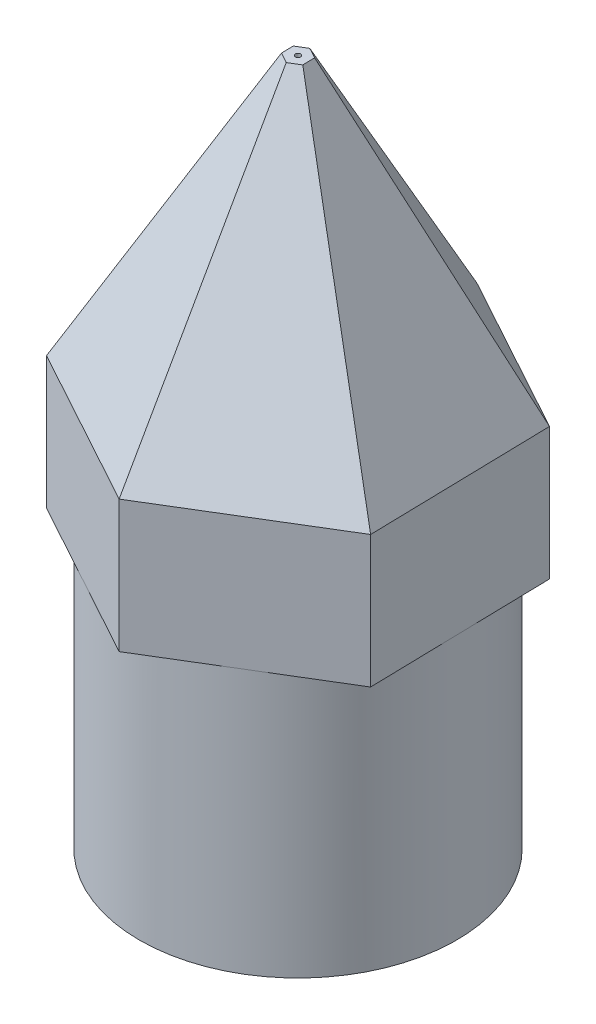
ISO-10303-21;
HEADER;
FILE_DESCRIPTION(('STEP AP214'),'2;1');
FILE_NAME('part.step','',(''),(''),'','','');
FILE_SCHEMA(('AUTOMOTIVE_DESIGN { 1 0 10303 214 1 1 1 1 }'));
ENDSEC;
DATA;
#1=APPLICATION_CONTEXT('core data for automotive mechanical design processes');
#2=APPLICATION_PROTOCOL_DEFINITION('international standard','automotive_design',2000,#1);
#3=PRODUCT_CONTEXT('',#1,'mechanical');
#4=PRODUCT('Part','Part','',(#3));
#5=PRODUCT_RELATED_PRODUCT_CATEGORY('part','',(#4));
#6=PRODUCT_DEFINITION_FORMATION('','',#4);
#7=PRODUCT_DEFINITION_CONTEXT('part definition',#1,'design');
#8=PRODUCT_DEFINITION('design','',#6,#7);
#9=PRODUCT_DEFINITION_SHAPE('','',#8);
#10=(LENGTH_UNIT() NAMED_UNIT(*) SI_UNIT(.MILLI.,.METRE.));
#11=(NAMED_UNIT(*) PLANE_ANGLE_UNIT() SI_UNIT($,.RADIAN.));
#12=(NAMED_UNIT(*) SI_UNIT($,.STERADIAN.) SOLID_ANGLE_UNIT());
#13=UNCERTAINTY_MEASURE_WITH_UNIT(LENGTH_MEASURE(1.E-05),#10,'distance_accuracy_value','');
#14=(GEOMETRIC_REPRESENTATION_CONTEXT(3) GLOBAL_UNCERTAINTY_ASSIGNED_CONTEXT((#13)) GLOBAL_UNIT_ASSIGNED_CONTEXT((#10,
#11,#12)) REPRESENTATION_CONTEXT('',''));
#15=CARTESIAN_POINT('',(0.,0.,0.));
#16=DIRECTION('',(0.,0.,1.));
#17=DIRECTION('',(1.,0.,0.));
#18=AXIS2_PLACEMENT_3D('',#15,#16,#17);
#19=CARTESIAN_POINT('',(0.,0.,0.));
#20=DIRECTION('',(0.,1.,0.));
#21=DIRECTION('',(0.,0.,1.));
#22=AXIS2_PLACEMENT_3D('',#19,#20,#21);
#23=CYLINDRICAL_SURFACE('',#22,0.05);
#24=CARTESIAN_POINT('',(0.,13.,0.));
#25=DIRECTION('',(0.,1.,0.));
#26=DIRECTION('',(0.,0.,1.));
#27=AXIS2_PLACEMENT_3D('',#24,#25,#26);
#28=CIRCLE('',#27,0.05);
#29=CARTESIAN_POINT('',(0.,13.,0.05));
#30=VERTEX_POINT('',#29);
#31=EDGE_CURVE('E297',#30,#30,#28,.T.);
#32=ORIENTED_EDGE('',*,*,#31,.T.);
#33=EDGE_LOOP('',(#32));
#34=FACE_BOUND('',#33,.T.);
#35=CARTESIAN_POINT('',(0.,7.5,0.));
#36=DIRECTION('',(0.,-1.,0.));
#37=DIRECTION('',(0.,0.,-1.));
#38=AXIS2_PLACEMENT_3D('',#35,#36,#37);
#39=CIRCLE('',#38,0.05);
#40=CARTESIAN_POINT('',(0.,7.5,-0.05));
#41=VERTEX_POINT('',#40);
#42=EDGE_CURVE('E43',#41,#41,#39,.F.);
#43=ORIENTED_EDGE('',*,*,#42,.F.);
#44=EDGE_LOOP('',(#43));
#45=FACE_BOUND('',#44,.T.);
#46=ADVANCED_FACE('F39',(#34,#45),#23,.F.);
#47=CARTESIAN_POINT('',(0.,5.,0.));
#48=DIRECTION('',(0.,-1.,0.));
#49=DIRECTION('',(0.,0.,-1.));
#50=AXIS2_PLACEMENT_3D('',#47,#48,#49);
#51=CYLINDRICAL_SURFACE('',#50,3.);
#52=CARTESIAN_POINT('',(0.,5.,0.));
#53=DIRECTION('',(0.,1.,0.));
#54=DIRECTION('',(0.,0.,1.));
#55=AXIS2_PLACEMENT_3D('',#52,#53,#54);
#56=CIRCLE('',#55,3.);
#57=CARTESIAN_POINT('',(1.55829101424744,5.,2.56353839739445));
#58=VERTEX_POINT('',#57);
#59=CARTESIAN_POINT('',(2.99923488284416,5.,-0.0677504061300782));
#60=VERTEX_POINT('',#59);
#61=EDGE_CURVE('E11',#58,#60,#56,.T.);
#62=ORIENTED_EDGE('',*,*,#61,.F.);
#63=CARTESIAN_POINT('',(-1.44094386859672,5.,2.63128880352452));
#64=VERTEX_POINT('',#63);
#65=EDGE_CURVE('E51',#64,#58,#56,.T.);
#66=ORIENTED_EDGE('',*,*,#65,.F.);
#67=CARTESIAN_POINT('',(-2.99923488284416,5.,0.0677504061300774));
#68=VERTEX_POINT('',#67);
#69=EDGE_CURVE('E61',#68,#64,#56,.T.);
#70=ORIENTED_EDGE('',*,*,#69,.F.);
#71=CARTESIAN_POINT('',(-1.55829101424744,5.,-2.56353839739445));
#72=VERTEX_POINT('',#71);
#73=EDGE_CURVE('E231',#72,#68,#56,.T.);
#74=ORIENTED_EDGE('',*,*,#73,.F.);
#75=CARTESIAN_POINT('',(1.44094386859672,5.,-2.63128880352453));
#76=VERTEX_POINT('',#75);
#77=EDGE_CURVE('E236',#76,#72,#56,.T.);
#78=ORIENTED_EDGE('',*,*,#77,.F.);
#79=EDGE_CURVE('E49',#60,#76,#56,.T.);
#80=ORIENTED_EDGE('',*,*,#79,.F.);
#81=EDGE_LOOP('',(#62,#66,#70,#74,#78,#80));
#82=FACE_BOUND('',#81,.T.);
#83=CARTESIAN_POINT('',(0.,0.,0.));
#84=DIRECTION('',(0.,1.,0.));
#85=DIRECTION('',(0.,0.,1.));
#86=AXIS2_PLACEMENT_3D('',#83,#84,#85);
#87=CIRCLE('',#86,3.);
#88=CARTESIAN_POINT('',(0.,0.,3.));
#89=VERTEX_POINT('',#88);
#90=EDGE_CURVE('E222',#89,#89,#87,.T.);
#91=ORIENTED_EDGE('',*,*,#90,.T.);
#92=EDGE_LOOP('',(#91));
#93=FACE_BOUND('',#92,.T.);
#94=ADVANCED_FACE('F41',(#82,#93),#51,.T.);
#95=CARTESIAN_POINT('',(0.,0.,0.));
#96=DIRECTION('',(0.,1.,0.));
#97=DIRECTION('',(0.,0.,1.));
#98=AXIS2_PLACEMENT_3D('',#95,#96,#97);
#99=PLANE('',#98);
#100=CARTESIAN_POINT('',(-0.05,0.,0.));
#101=DIRECTION('',(0.,-1.,0.));
#102=DIRECTION('',(0.,0.,-1.));
#103=AXIS2_PLACEMENT_3D('',#100,#101,#102);
#104=CIRCLE('',#103,2.12749457724864);
#105=CARTESIAN_POINT('',(-0.05,0.,-2.12749457724864));
#106=VERTEX_POINT('',#105);
#107=EDGE_CURVE('E307',#106,#106,#104,.T.);
#108=ORIENTED_EDGE('',*,*,#107,.F.);
#109=EDGE_LOOP('',(#108));
#110=FACE_BOUND('',#109,.T.);
#111=ORIENTED_EDGE('',*,*,#90,.F.);
#112=EDGE_LOOP('',(#111));
#113=FACE_BOUND('',#112,.T.);
#114=ADVANCED_FACE('F353',(#110,#113),#99,.F.);
#115=CARTESIAN_POINT('',(0.,5.,0.));
#116=DIRECTION('',(0.,1.,0.));
#117=DIRECTION('',(0.,0.,1.));
#118=AXIS2_PLACEMENT_3D('',#115,#116,#117);
#119=PLANE('',#118);
#120=DIRECTION('',(0.854512799131482,0.,-0.51943033808248));
#121=VECTOR('',#120,1.);
#122=CARTESIAN_POINT('',(0.0782314304338125,5.,3.46321813394598));
#123=LINE('',#122,#121);
#124=CARTESIAN_POINT('',(3.03835059806106,5.,1.66385866084291));
#125=VERTEX_POINT('',#124);
#126=EDGE_CURVE('E167',#58,#125,#123,.T.);
#127=ORIENTED_EDGE('',*,*,#126,.F.);
#128=ORIENTED_EDGE('',*,*,#61,.T.);
#129=DIRECTION('',(-0.0225834687100261,0.,-0.999744960948053));
#130=VECTOR('',#129,1.);
#131=CARTESIAN_POINT('',(3.03835059806106,5.,1.66385866084291));
#132=LINE('',#131,#130);
#133=EDGE_CURVE('E186',#125,#60,#132,.T.);
#134=ORIENTED_EDGE('',*,*,#133,.F.);
#135=EDGE_LOOP('',(#127,#128,#134));
#136=FACE_BOUND('',#135,.T.);
#137=ADVANCED_FACE('F481',(#136),#119,.F.);
#138=CARTESIAN_POINT('',(2.96011916762725,5.,-1.79935947310307));
#139=VERTEX_POINT('',#138);
#140=EDGE_CURVE('E185',#60,#139,#132,.T.);
#141=ORIENTED_EDGE('',*,*,#140,.F.);
#142=ORIENTED_EDGE('',*,*,#79,.T.);
#143=DIRECTION('',(-0.877096267841508,0.,-0.480314622865573));
#144=VECTOR('',#143,1.);
#145=CARTESIAN_POINT('',(2.96011916762725,5.,-1.79935947310307));
#146=LINE('',#145,#144);
#147=EDGE_CURVE('E191',#139,#76,#146,.T.);
#148=ORIENTED_EDGE('',*,*,#147,.F.);
#149=EDGE_LOOP('',(#141,#142,#148));
#150=FACE_BOUND('',#149,.T.);
#151=ADVANCED_FACE('F250',(#150),#119,.F.);
#152=CARTESIAN_POINT('',(-0.0782314304338134,5.,-3.46321813394598));
#153=VERTEX_POINT('',#152);
#154=EDGE_CURVE('E190',#76,#153,#146,.T.);
#155=ORIENTED_EDGE('',*,*,#154,.F.);
#156=ORIENTED_EDGE('',*,*,#77,.T.);
#157=DIRECTION('',(-0.854512799131482,0.,0.51943033808248));
#158=VECTOR('',#157,1.);
#159=CARTESIAN_POINT('',(-0.0782314304338134,5.,-3.46321813394598));
#160=LINE('',#159,#158);
#161=EDGE_CURVE('E196',#153,#72,#160,.T.);
#162=ORIENTED_EDGE('',*,*,#161,.F.);
#163=EDGE_LOOP('',(#155,#156,#162));
#164=FACE_BOUND('',#163,.T.);
#165=ADVANCED_FACE('F251',(#164),#119,.F.);
#166=CARTESIAN_POINT('',(-3.03835059806107,5.,-1.66385866084291));
#167=VERTEX_POINT('',#166);
#168=EDGE_CURVE('E195',#72,#167,#160,.T.);
#169=ORIENTED_EDGE('',*,*,#168,.F.);
#170=ORIENTED_EDGE('',*,*,#73,.T.);
#171=DIRECTION('',(0.0225834687100258,0.,0.999744960948053));
#172=VECTOR('',#171,1.);
#173=CARTESIAN_POINT('',(-3.03835059806107,5.,-1.66385866084291));
#174=LINE('',#173,#172);
#175=EDGE_CURVE('E201',#167,#68,#174,.T.);
#176=ORIENTED_EDGE('',*,*,#175,.F.);
#177=EDGE_LOOP('',(#169,#170,#176));
#178=FACE_BOUND('',#177,.T.);
#179=ADVANCED_FACE('F488',(#178),#119,.F.);
#180=CARTESIAN_POINT('',(-2.96011916762725,5.,1.79935947310307));
#181=VERTEX_POINT('',#180);
#182=EDGE_CURVE('E200',#68,#181,#174,.T.);
#183=ORIENTED_EDGE('',*,*,#182,.F.);
#184=ORIENTED_EDGE('',*,*,#69,.T.);
#185=DIRECTION('',(0.877096267841508,0.,0.480314622865573));
#186=VECTOR('',#185,1.);
#187=CARTESIAN_POINT('',(-2.96011916762725,5.,1.79935947310307));
#188=LINE('',#187,#186);
#189=EDGE_CURVE('E144',#181,#64,#188,.T.);
#190=ORIENTED_EDGE('',*,*,#189,.F.);
#191=EDGE_LOOP('',(#183,#184,#190));
#192=FACE_BOUND('',#191,.T.);
#193=ADVANCED_FACE('F479',(#192),#119,.F.);
#194=CARTESIAN_POINT('',(0.0782314304338125,5.,3.46321813394598));
#195=VERTEX_POINT('',#194);
#196=EDGE_CURVE('E155',#64,#195,#188,.T.);
#197=ORIENTED_EDGE('',*,*,#196,.F.);
#198=ORIENTED_EDGE('',*,*,#65,.T.);
#199=EDGE_CURVE('E182',#195,#58,#123,.T.);
#200=ORIENTED_EDGE('',*,*,#199,.F.);
#201=EDGE_LOOP('',(#197,#198,#200));
#202=FACE_BOUND('',#201,.T.);
#203=ADVANCED_FACE('F471',(#202),#119,.F.);
#204=CARTESIAN_POINT('',(0.0782314304338125,7.5,3.46321813394598));
#205=DIRECTION('',(-0.51943033808248,0.,-0.854512799131482));
#206=DIRECTION('',(-0.854512799131482,0.,0.51943033808248));
#207=AXIS2_PLACEMENT_3D('',#204,#205,#206);
#208=PLANE('',#207);
#209=ORIENTED_EDGE('',*,*,#199,.T.);
#210=ORIENTED_EDGE('',*,*,#126,.T.);
#211=DIRECTION('',(0.,-1.,0.));
#212=VECTOR('',#211,1.);
#213=CARTESIAN_POINT('',(3.03835059806106,7.5,1.66385866084291));
#214=LINE('',#213,#212);
#215=CARTESIAN_POINT('',(3.03835059806106,7.5,1.66385866084291));
#216=VERTEX_POINT('',#215);
#217=EDGE_CURVE('E137',#216,#125,#214,.T.);
#218=ORIENTED_EDGE('',*,*,#217,.F.);
#219=DIRECTION('',(0.854512799131482,0.,-0.51943033808248));
#220=VECTOR('',#219,1.);
#221=CARTESIAN_POINT('',(0.0782314304338125,7.5,3.46321813394598));
#222=LINE('',#221,#220);
#223=CARTESIAN_POINT('',(0.0782314304338125,7.5,3.46321813394598));
#224=VERTEX_POINT('',#223);
#225=EDGE_CURVE('E130',#224,#216,#222,.T.);
#226=ORIENTED_EDGE('',*,*,#225,.F.);
#227=DIRECTION('',(0.,-1.,0.));
#228=VECTOR('',#227,1.);
#229=CARTESIAN_POINT('',(0.0782314304338125,7.5,3.46321813394598));
#230=LINE('',#229,#228);
#231=EDGE_CURVE('E134',#224,#195,#230,.T.);
#232=ORIENTED_EDGE('',*,*,#231,.T.);
#233=EDGE_LOOP('',(#209,#210,#218,#226,#232));
#234=FACE_BOUND('',#233,.T.);
#235=ADVANCED_FACE('F133',(#234),#208,.F.);
#236=CARTESIAN_POINT('',(3.03835059806106,7.5,1.66385866084291));
#237=DIRECTION('',(-0.999744960948053,0.,0.0225834687100261));
#238=DIRECTION('',(0.0225834687100261,0.,0.999744960948053));
#239=AXIS2_PLACEMENT_3D('',#236,#237,#238);
#240=PLANE('',#239);
#241=ORIENTED_EDGE('',*,*,#133,.T.);
#242=ORIENTED_EDGE('',*,*,#140,.T.);
#243=DIRECTION('',(0.,-1.,0.));
#244=VECTOR('',#243,1.);
#245=CARTESIAN_POINT('',(2.96011916762725,7.5,-1.79935947310307));
#246=LINE('',#245,#244);
#247=CARTESIAN_POINT('',(2.96011916762725,7.5,-1.79935947310307));
#248=VERTEX_POINT('',#247);
#249=EDGE_CURVE('E217',#248,#139,#246,.T.);
#250=ORIENTED_EDGE('',*,*,#249,.F.);
#251=DIRECTION('',(-0.0225834687100261,0.,-0.999744960948053));
#252=VECTOR('',#251,1.);
#253=CARTESIAN_POINT('',(3.03835059806106,7.5,1.66385866084291));
#254=LINE('',#253,#252);
#255=EDGE_CURVE('E143',#216,#248,#254,.T.);
#256=ORIENTED_EDGE('',*,*,#255,.F.);
#257=ORIENTED_EDGE('',*,*,#217,.T.);
#258=EDGE_LOOP('',(#241,#242,#250,#256,#257));
#259=FACE_BOUND('',#258,.T.);
#260=ADVANCED_FACE('F260',(#259),#240,.F.);
#261=CARTESIAN_POINT('',(2.96011916762725,7.5,-1.79935947310307));
#262=DIRECTION('',(-0.480314622865573,0.,0.877096267841508));
#263=DIRECTION('',(0.877096267841508,0.,0.480314622865573));
#264=AXIS2_PLACEMENT_3D('',#261,#262,#263);
#265=PLANE('',#264);
#266=ORIENTED_EDGE('',*,*,#147,.T.);
#267=ORIENTED_EDGE('',*,*,#154,.T.);
#268=DIRECTION('',(0.,-1.,0.));
#269=VECTOR('',#268,1.);
#270=CARTESIAN_POINT('',(-0.0782314304338134,7.5,-3.46321813394598));
#271=LINE('',#270,#269);
#272=CARTESIAN_POINT('',(-0.0782314304338134,7.5,-3.46321813394598));
#273=VERTEX_POINT('',#272);
#274=EDGE_CURVE('E213',#273,#153,#271,.T.);
#275=ORIENTED_EDGE('',*,*,#274,.F.);
#276=DIRECTION('',(-0.877096267841508,0.,-0.480314622865573));
#277=VECTOR('',#276,1.);
#278=CARTESIAN_POINT('',(2.96011916762725,7.5,-1.79935947310307));
#279=LINE('',#278,#277);
#280=EDGE_CURVE('E257',#248,#273,#279,.T.);
#281=ORIENTED_EDGE('',*,*,#280,.F.);
#282=ORIENTED_EDGE('',*,*,#249,.T.);
#283=EDGE_LOOP('',(#266,#267,#275,#281,#282));
#284=FACE_BOUND('',#283,.T.);
#285=ADVANCED_FACE('F254',(#284),#265,.F.);
#286=CARTESIAN_POINT('',(-0.0782314304338134,7.5,-3.46321813394598));
#287=DIRECTION('',(0.51943033808248,0.,0.854512799131482));
#288=DIRECTION('',(0.854512799131482,0.,-0.51943033808248));
#289=AXIS2_PLACEMENT_3D('',#286,#287,#288);
#290=PLANE('',#289);
#291=ORIENTED_EDGE('',*,*,#161,.T.);
#292=ORIENTED_EDGE('',*,*,#168,.T.);
#293=DIRECTION('',(0.,-1.,0.));
#294=VECTOR('',#293,1.);
#295=CARTESIAN_POINT('',(-3.03835059806107,7.5,-1.66385866084291));
#296=LINE('',#295,#294);
#297=CARTESIAN_POINT('',(-3.03835059806107,7.5,-1.66385866084291));
#298=VERTEX_POINT('',#297);
#299=EDGE_CURVE('E209',#298,#167,#296,.T.);
#300=ORIENTED_EDGE('',*,*,#299,.F.);
#301=DIRECTION('',(-0.854512799131482,0.,0.51943033808248));
#302=VECTOR('',#301,1.);
#303=CARTESIAN_POINT('',(-0.0782314304338134,7.5,-3.46321813394598));
#304=LINE('',#303,#302);
#305=EDGE_CURVE('E178',#273,#298,#304,.T.);
#306=ORIENTED_EDGE('',*,*,#305,.F.);
#307=ORIENTED_EDGE('',*,*,#274,.T.);
#308=EDGE_LOOP('',(#291,#292,#300,#306,#307));
#309=FACE_BOUND('',#308,.T.);
#310=ADVANCED_FACE('F441',(#309),#290,.F.);
#311=CARTESIAN_POINT('',(-3.03835059806107,7.5,-1.66385866084291));
#312=DIRECTION('',(0.999744960948053,0.,-0.0225834687100258));
#313=DIRECTION('',(-0.0225834687100258,0.,-0.999744960948053));
#314=AXIS2_PLACEMENT_3D('',#311,#312,#313);
#315=PLANE('',#314);
#316=ORIENTED_EDGE('',*,*,#175,.T.);
#317=ORIENTED_EDGE('',*,*,#182,.T.);
#318=DIRECTION('',(0.,-1.,0.));
#319=VECTOR('',#318,1.);
#320=CARTESIAN_POINT('',(-2.96011916762725,7.5,1.79935947310307));
#321=LINE('',#320,#319);
#322=CARTESIAN_POINT('',(-2.96011916762725,7.5,1.79935947310307));
#323=VERTEX_POINT('',#322);
#324=EDGE_CURVE('E157',#323,#181,#321,.T.);
#325=ORIENTED_EDGE('',*,*,#324,.F.);
#326=DIRECTION('',(0.0225834687100258,0.,0.999744960948053));
#327=VECTOR('',#326,1.);
#328=CARTESIAN_POINT('',(-3.03835059806107,7.5,-1.66385866084291));
#329=LINE('',#328,#327);
#330=EDGE_CURVE('E175',#298,#323,#329,.T.);
#331=ORIENTED_EDGE('',*,*,#330,.F.);
#332=ORIENTED_EDGE('',*,*,#299,.T.);
#333=EDGE_LOOP('',(#316,#317,#325,#331,#332));
#334=FACE_BOUND('',#333,.T.);
#335=ADVANCED_FACE('F433',(#334),#315,.F.);
#336=CARTESIAN_POINT('',(-2.96011916762725,7.5,1.79935947310307));
#337=DIRECTION('',(0.480314622865573,0.,-0.877096267841508));
#338=DIRECTION('',(-0.877096267841508,0.,-0.480314622865573));
#339=AXIS2_PLACEMENT_3D('',#336,#337,#338);
#340=PLANE('',#339);
#341=ORIENTED_EDGE('',*,*,#189,.T.);
#342=ORIENTED_EDGE('',*,*,#196,.T.);
#343=ORIENTED_EDGE('',*,*,#231,.F.);
#344=DIRECTION('',(0.877096267841508,0.,0.480314622865573));
#345=VECTOR('',#344,1.);
#346=CARTESIAN_POINT('',(-2.96011916762725,7.5,1.79935947310307));
#347=LINE('',#346,#345);
#348=EDGE_CURVE('E152',#323,#224,#347,.T.);
#349=ORIENTED_EDGE('',*,*,#348,.F.);
#350=ORIENTED_EDGE('',*,*,#324,.T.);
#351=EDGE_LOOP('',(#341,#342,#343,#349,#350));
#352=FACE_BOUND('',#351,.T.);
#353=ADVANCED_FACE('F149',(#352),#340,.F.);
#354=CARTESIAN_POINT('',(-2.96011916762725,7.5,1.79935947310307));
#355=DIRECTION('',(-0.427963462636301,0.453990499739548,0.781498496988051));
#356=DIRECTION('',(0.,-0.864684581342474,0.502315214570084));
#357=AXIS2_PLACEMENT_3D('',#354,#355,#356);
#358=PLANE('',#357);
#359=ORIENTED_EDGE('',*,*,#348,.T.);
#360=DIRECTION('',(0.011451921892067,-0.861891266296484,0.506963804000661));
#361=VECTOR('',#360,1.);
#362=CARTESIAN_POINT('',(0.0782314304338128,7.5,3.46321813394598));
#363=LINE('',#362,#361);
#364=CARTESIAN_POINT('',(0.00515310504711373,13.,0.228122210553155));
#365=VERTEX_POINT('',#364);
#366=EDGE_CURVE('E160',#365,#224,#363,.T.);
#367=ORIENTED_EDGE('',*,*,#366,.F.);
#368=DIRECTION('',(-0.877096267841508,0.,-0.480314622865573));
#369=VECTOR('',#368,1.);
#370=CARTESIAN_POINT('',(-1.61409028499844,13.,-0.658606312567004));
#371=LINE('',#370,#369);
#372=CARTESIAN_POINT('',(-0.194983076982938,13.,0.11852382515575));
#373=VERTEX_POINT('',#372);
#374=EDGE_CURVE('E294',#373,#365,#371,.F.);
#375=ORIENTED_EDGE('',*,*,#374,.F.);
#376=DIRECTION('',(-0.433317572117734,-0.861891266296484,0.263399557281016));
#377=VECTOR('',#376,1.);
#378=CARTESIAN_POINT('',(-2.96011916762725,7.5,1.79935947310307));
#379=LINE('',#378,#377);
#380=EDGE_CURVE('E173',#373,#323,#379,.T.);
#381=ORIENTED_EDGE('',*,*,#380,.T.);
#382=EDGE_LOOP('',(#359,#367,#375,#381));
#383=FACE_BOUND('',#382,.T.);
#384=ADVANCED_FACE('F171',(#383),#358,.T.);
#385=CARTESIAN_POINT('',(0.0782314304338125,7.5,3.46321813394598));
#386=DIRECTION('',(0.462815820092859,0.453990499739548,0.761376479028614));
#387=DIRECTION('',(0.854512799131482,0.,-0.51943033808248));
#388=AXIS2_PLACEMENT_3D('',#385,#386,#387);
#389=PLANE('',#388);
#390=ORIENTED_EDGE('',*,*,#225,.T.);
#391=DIRECTION('',(0.444769494009801,-0.861891266296484,0.243564246719645));
#392=VECTOR('',#391,1.);
#393=CARTESIAN_POINT('',(3.03835059806106,7.5,1.66385866084291));
#394=LINE('',#393,#392);
#395=CARTESIAN_POINT('',(0.200136182030052,13.,0.109598385397406));
#396=VERTEX_POINT('',#395);
#397=EDGE_CURVE('E168',#396,#216,#394,.T.);
#398=ORIENTED_EDGE('',*,*,#397,.F.);
#399=DIRECTION('',(-0.854512799131482,0.,0.51943033808248));
#400=VECTOR('',#399,1.);
#401=CARTESIAN_POINT('',(-1.37741494027504,13.,1.06854003452682));
#402=LINE('',#401,#400);
#403=EDGE_CURVE('E162',#365,#396,#402,.F.);
#404=ORIENTED_EDGE('',*,*,#403,.F.);
#405=ORIENTED_EDGE('',*,*,#366,.T.);
#406=EDGE_LOOP('',(#390,#398,#404,#405));
#407=FACE_BOUND('',#406,.T.);
#408=ADVANCED_FACE('F161',(#407),#389,.T.);
#409=CARTESIAN_POINT('',(3.03835059806106,7.5,1.66385866084291));
#410=DIRECTION('',(0.890779282729159,0.453990499739548,-0.0201220179594371));
#411=DIRECTION('',(-0.454082437038674,0.890959673819763,0.));
#412=AXIS2_PLACEMENT_3D('',#409,#410,#411);
#413=PLANE('',#412);
#414=ORIENTED_EDGE('',*,*,#255,.T.);
#415=DIRECTION('',(0.433317572117734,-0.861891266296484,-0.263399557281016));
#416=VECTOR('',#415,1.);
#417=CARTESIAN_POINT('',(2.96011916762725,7.5,-1.79935947310307));
#418=LINE('',#417,#416);
#419=CARTESIAN_POINT('',(0.194983076982937,13.,-0.11852382515575));
#420=VERTEX_POINT('',#419);
#421=EDGE_CURVE('E266',#420,#248,#418,.T.);
#422=ORIENTED_EDGE('',*,*,#421,.F.);
#423=DIRECTION('',(0.0225834687100261,0.,0.999744960948053));
#424=VECTOR('',#423,1.);
#425=CARTESIAN_POINT('',(0.236675344723401,13.,1.72714634709382));
#426=LINE('',#425,#424);
#427=EDGE_CURVE('E289',#396,#420,#426,.F.);
#428=ORIENTED_EDGE('',*,*,#427,.F.);
#429=ORIENTED_EDGE('',*,*,#397,.T.);
#430=EDGE_LOOP('',(#414,#422,#428,#429));
#431=FACE_BOUND('',#430,.T.);
#432=ADVANCED_FACE('F338',(#431),#413,.T.);
#433=CARTESIAN_POINT('',(2.96011916762725,7.5,-1.79935947310307));
#434=DIRECTION('',(0.427963462636301,0.453990499739548,-0.781498496988051));
#435=DIRECTION('',(0.,0.864684581342474,0.502315214570084));
#436=AXIS2_PLACEMENT_3D('',#433,#434,#435);
#437=PLANE('',#436);
#438=ORIENTED_EDGE('',*,*,#280,.T.);
#439=DIRECTION('',(-0.011451921892067,-0.861891266296484,-0.506963804000661));
#440=VECTOR('',#439,1.);
#441=CARTESIAN_POINT('',(-0.0782314304338134,7.5,-3.46321813394598));
#442=LINE('',#441,#440);
#443=CARTESIAN_POINT('',(-0.00515310504711403,13.,-0.228122210553156));
#444=VERTEX_POINT('',#443);
#445=EDGE_CURVE('E270',#444,#273,#442,.T.);
#446=ORIENTED_EDGE('',*,*,#445,.F.);
#447=DIRECTION('',(0.877096267841508,0.,0.480314622865573));
#448=VECTOR('',#447,1.);
#449=CARTESIAN_POINT('',(1.61409028499844,13.,0.658606312567003));
#450=LINE('',#449,#448);
#451=EDGE_CURVE('E286',#420,#444,#450,.F.);
#452=ORIENTED_EDGE('',*,*,#451,.F.);
#453=ORIENTED_EDGE('',*,*,#421,.T.);
#454=EDGE_LOOP('',(#438,#446,#452,#453));
#455=FACE_BOUND('',#454,.T.);
#456=ADVANCED_FACE('F336',(#455),#437,.T.);
#457=CARTESIAN_POINT('',(-0.0782314304338134,7.5,-3.46321813394598));
#458=DIRECTION('',(-0.462815820092859,0.453990499739548,-0.761376479028614));
#459=DIRECTION('',(-0.854512799131482,0.,0.51943033808248));
#460=AXIS2_PLACEMENT_3D('',#457,#458,#459);
#461=PLANE('',#460);
#462=ORIENTED_EDGE('',*,*,#305,.T.);
#463=DIRECTION('',(-0.444769494009801,-0.861891266296484,-0.243564246719646));
#464=VECTOR('',#463,1.);
#465=CARTESIAN_POINT('',(-3.03835059806107,7.5,-1.66385866084291));
#466=LINE('',#465,#464);
#467=CARTESIAN_POINT('',(-0.200136182030053,13.,-0.109598385397407));
#468=VERTEX_POINT('',#467);
#469=EDGE_CURVE('E274',#468,#298,#466,.T.);
#470=ORIENTED_EDGE('',*,*,#469,.F.);
#471=DIRECTION('',(0.854512799131482,0.,-0.51943033808248));
#472=VECTOR('',#471,1.);
#473=CARTESIAN_POINT('',(1.37741494027504,13.,-1.06854003452682));
#474=LINE('',#473,#472);
#475=EDGE_CURVE('E283',#444,#468,#474,.F.);
#476=ORIENTED_EDGE('',*,*,#475,.F.);
#477=ORIENTED_EDGE('',*,*,#445,.T.);
#478=EDGE_LOOP('',(#462,#470,#476,#477));
#479=FACE_BOUND('',#478,.T.);
#480=ADVANCED_FACE('F322',(#479),#461,.T.);
#481=CARTESIAN_POINT('',(-3.03835059806107,7.5,-1.66385866084291));
#482=DIRECTION('',(-0.89077928272916,0.453990499739548,0.0201220179594369));
#483=DIRECTION('',(-0.454082437038674,-0.890959673819763,0.));
#484=AXIS2_PLACEMENT_3D('',#481,#482,#483);
#485=PLANE('',#484);
#486=ORIENTED_EDGE('',*,*,#330,.T.);
#487=ORIENTED_EDGE('',*,*,#380,.F.);
#488=DIRECTION('',(-0.0225834687100258,0.,-0.999744960948053));
#489=VECTOR('',#488,1.);
#490=CARTESIAN_POINT('',(-0.236675344723402,13.,-1.72714634709382));
#491=LINE('',#490,#489);
#492=EDGE_CURVE('E280',#468,#373,#491,.F.);
#493=ORIENTED_EDGE('',*,*,#492,.F.);
#494=ORIENTED_EDGE('',*,*,#469,.T.);
#495=EDGE_LOOP('',(#486,#487,#493,#494));
#496=FACE_BOUND('',#495,.T.);
#497=ADVANCED_FACE('F328',(#496),#485,.T.);
#498=CARTESIAN_POINT('',(0.,13.,0.));
#499=DIRECTION('',(0.,1.,0.));
#500=DIRECTION('',(0.,0.,1.));
#501=AXIS2_PLACEMENT_3D('',#498,#499,#500);
#502=PLANE('',#501);
#503=ORIENTED_EDGE('',*,*,#31,.F.);
#504=EDGE_LOOP('',(#503));
#505=FACE_BOUND('',#504,.T.);
#506=ORIENTED_EDGE('',*,*,#374,.T.);
#507=ORIENTED_EDGE('',*,*,#403,.T.);
#508=ORIENTED_EDGE('',*,*,#427,.T.);
#509=ORIENTED_EDGE('',*,*,#451,.T.);
#510=ORIENTED_EDGE('',*,*,#475,.T.);
#511=ORIENTED_EDGE('',*,*,#492,.T.);
#512=EDGE_LOOP('',(#506,#507,#508,#509,#510,#511));
#513=FACE_BOUND('',#512,.T.);
#514=ADVANCED_FACE('F331',(#505,#513),#502,.T.);
#515=CARTESIAN_POINT('',(-0.05,7.5,0.));
#516=DIRECTION('',(0.,-1.,0.));
#517=DIRECTION('',(0.,0.,-1.));
#518=AXIS2_PLACEMENT_3D('',#515,#516,#517);
#519=PLANE('',#518);
#520=CARTESIAN_POINT('',(-0.05,7.5,0.));
#521=DIRECTION('',(0.,-1.,0.));
#522=DIRECTION('',(0.,0.,-1.));
#523=AXIS2_PLACEMENT_3D('',#520,#521,#522);
#524=CIRCLE('',#523,0.117875634015217);
#525=CARTESIAN_POINT('',(-0.05,7.5,-0.117875634015217));
#526=VERTEX_POINT('',#525);
#527=EDGE_CURVE('E304',#526,#526,#524,.T.);
#528=ORIENTED_EDGE('',*,*,#527,.T.);
#529=EDGE_LOOP('',(#528));
#530=FACE_BOUND('',#529,.T.);
#531=ORIENTED_EDGE('',*,*,#42,.T.);
#532=EDGE_LOOP('',(#531));
#533=FACE_BOUND('',#532,.T.);
#534=ADVANCED_FACE('F361',(#530,#533),#519,.T.);
#535=CARTESIAN_POINT('',(-0.05,0.,0.));
#536=DIRECTION('',(0.,-1.,0.));
#537=DIRECTION('',(0.,0.,-1.));
#538=AXIS2_PLACEMENT_3D('',#535,#536,#537);
#539=CONICAL_SURFACE('',#538,2.12749457724864,0.261799387799149);
#540=CARTESIAN_POINT('',(-0.05,7.5,-0.117875634015217));
#541=CARTESIAN_POINT('',(-0.05,7.421875,-0.138809164673898));
#542=CARTESIAN_POINT('',(-0.05,7.34375,-0.15974269533258));
#543=CARTESIAN_POINT('',(-0.05,7.1875,-0.201609756649943));
#544=CARTESIAN_POINT('',(-0.05,7.109375,-0.222543287308624));
#545=CARTESIAN_POINT('',(-0.05,6.953125,-0.264410348625987));
#546=CARTESIAN_POINT('',(-0.05,6.875,-0.285343879284669));
#547=CARTESIAN_POINT('',(-0.05,6.71875,-0.327210940602032));
#548=CARTESIAN_POINT('',(-0.05,6.640625,-0.348144471260713));
#549=CARTESIAN_POINT('',(-0.05,6.484375,-0.390011532578076));
#550=CARTESIAN_POINT('',(-0.05,6.40625,-0.410945063236758));
#551=CARTESIAN_POINT('',(-0.05,6.25,-0.45281212455412));
#552=CARTESIAN_POINT('',(-0.05,6.171875,-0.473745655212802));
#553=CARTESIAN_POINT('',(-0.05,6.015625,-0.515612716530165));
#554=CARTESIAN_POINT('',(-0.05,5.9375,-0.536546247188846));
#555=CARTESIAN_POINT('',(-0.05,5.78125,-0.578413308506209));
#556=CARTESIAN_POINT('',(-0.05,5.703125,-0.599346839164891));
#557=CARTESIAN_POINT('',(-0.05,5.546875,-0.641213900482254));
#558=CARTESIAN_POINT('',(-0.05,5.46875,-0.662147431140935));
#559=CARTESIAN_POINT('',(-0.05,5.3125,-0.704014492458298));
#560=CARTESIAN_POINT('',(-0.05,5.234375,-0.72494802311698));
#561=CARTESIAN_POINT('',(-0.05,5.078125,-0.766815084434342));
#562=CARTESIAN_POINT('',(-0.05,5.,-0.787748615093024));
#563=CARTESIAN_POINT('',(-0.05,4.84375,-0.829615676410387));
#564=CARTESIAN_POINT('',(-0.05,4.765625,-0.850549207069068));
#565=CARTESIAN_POINT('',(-0.05,4.609375,-0.892416268386431));
#566=CARTESIAN_POINT('',(-0.05,4.53125,-0.913349799045113));
#567=CARTESIAN_POINT('',(-0.05,4.375,-0.955216860362476));
#568=CARTESIAN_POINT('',(-0.05,4.296875,-0.976150391021157));
#569=CARTESIAN_POINT('',(-0.05,4.140625,-1.01801745233852));
#570=CARTESIAN_POINT('',(-0.05,4.0625,-1.0389509829972));
#571=CARTESIAN_POINT('',(-0.05,3.90625,-1.08081804431456));
#572=CARTESIAN_POINT('',(-0.05,3.828125,-1.10175157497325));
#573=CARTESIAN_POINT('',(-0.05,3.671875,-1.14361863629061));
#574=CARTESIAN_POINT('',(-0.05,3.59375,-1.16455216694929));
#575=CARTESIAN_POINT('',(-0.05,3.4375,-1.20641922826665));
#576=CARTESIAN_POINT('',(-0.05,3.359375,-1.22735275892533));
#577=CARTESIAN_POINT('',(-0.05,3.203125,-1.2692198202427));
#578=CARTESIAN_POINT('',(-0.05,3.125,-1.29015335090138));
#579=CARTESIAN_POINT('',(-0.05,2.96875,-1.33202041221874));
#580=CARTESIAN_POINT('',(-0.05,2.890625,-1.35295394287742));
#581=CARTESIAN_POINT('',(-0.05,2.734375,-1.39482100419479));
#582=CARTESIAN_POINT('',(-0.05,2.65625,-1.41575453485347));
#583=CARTESIAN_POINT('',(-0.05,2.5,-1.45762159617083));
#584=CARTESIAN_POINT('',(-0.05,2.421875,-1.47855512682951));
#585=CARTESIAN_POINT('',(-0.05,2.265625,-1.52042218814687));
#586=CARTESIAN_POINT('',(-0.05,2.1875,-1.54135571880556));
#587=CARTESIAN_POINT('',(-0.05,2.03125,-1.58322278012292));
#588=CARTESIAN_POINT('',(-0.05,1.953125,-1.6041563107816));
#589=CARTESIAN_POINT('',(-0.05,1.796875,-1.64602337209896));
#590=CARTESIAN_POINT('',(-0.05,1.71875,-1.66695690275765));
#591=CARTESIAN_POINT('',(-0.05,1.5625,-1.70882396407501));
#592=CARTESIAN_POINT('',(-0.05,1.484375,-1.72975749473369));
#593=CARTESIAN_POINT('',(-0.05,1.328125,-1.77162455605105));
#594=CARTESIAN_POINT('',(-0.05,1.25,-1.79255808670973));
#595=CARTESIAN_POINT('',(-0.05,1.09375,-1.8344251480271));
#596=CARTESIAN_POINT('',(-0.05,1.015625,-1.85535867868578));
#597=CARTESIAN_POINT('',(-0.05,0.859375,-1.89722574000314));
#598=CARTESIAN_POINT('',(-0.05,0.78125,-1.91815927066182));
#599=CARTESIAN_POINT('',(-0.05,0.625,-1.96002633197919));
#600=CARTESIAN_POINT('',(-0.05,0.546875,-1.98095986263787));
#601=CARTESIAN_POINT('',(-0.05,0.390625,-2.02282692395523));
#602=CARTESIAN_POINT('',(-0.05,0.3125,-2.04376045461391));
#603=CARTESIAN_POINT('',(-0.05,0.15625,-2.08562751593127));
#604=CARTESIAN_POINT('',(-0.05,0.0781250000000001,-2.10656104658996));
#605=CARTESIAN_POINT('',(-0.05,0.,-2.12749457724864));
#606=B_SPLINE_CURVE_WITH_KNOTS('',3,(#540,#541,#542,#543,#544,#545,#546,#547,#548,#549,#550,
#551,#552,#553,#554,#555,#556,#557,#558,#559,#560,#561,#562,#563,#564,#565,#566,#567,#568,#569,
#570,#571,#572,#573,#574,#575,#576,#577,#578,#579,#580,#581,#582,#583,#584,#585,#586,#587,#588,
#589,#590,#591,#592,#593,#594,#595,#596,#597,#598,#599,#600,#601,#602,#603,#604,#605),
.UNSPECIFIED.,.F.,.F.,(4,2,2,2,2,2,2,2,2,2,2,2,2,2,2,2,2,2,2,2,2,2,2,2,2,2,2,2,2,2,2,2,4),(0.,
0.242642854783613,0.485285709567227,0.727928564350839,0.970571419134453,1.21321427391807,
1.45585712870168,1.69849998348529,1.94114283826891,2.18378569305252,2.42642854783613,
2.66907140261974,2.91171425740336,3.15435711218697,3.39699996697058,3.6396428217542,
3.88228567653781,4.12492853132142,4.36757138610504,4.61021424088865,4.85285709567226,
5.09549995045588,5.33814280523949,5.5807856600231,5.82342851480672,6.06607136959033,
6.30871422437394,6.55135707915755,6.79399993394117,7.03664278872478,7.27928564350839,
7.52192849829201,7.76457135307562),.UNSPECIFIED.);
#607=EDGE_CURVE('BSEAM357',#526,#106,#606,.T.);
#608=ORIENTED_EDGE('',*,*,#527,.F.);
#609=ORIENTED_EDGE('',*,*,#107,.T.);
#610=ORIENTED_EDGE('',*,*,#607,.T.);
#611=ORIENTED_EDGE('',*,*,#607,.F.);
#612=EDGE_LOOP('',(#608,#610,#609,#611));
#613=FACE_BOUND('',#612,.T.);
#614=ADVANCED_FACE('F357',(#613),#539,.F.);
#615=CLOSED_SHELL('',(#46,#94,#114,#137,#151,#165,#179,#193,#203,#235,#260,#285,#310,#335,#353,
#384,#408,#432,#456,#480,#497,#514,#534,#614));
#616=MANIFOLD_SOLID_BREP('B2',#615);
#617=ADVANCED_BREP_SHAPE_REPRESENTATION('',(#18,#616),#14);
#618=SHAPE_DEFINITION_REPRESENTATION(#9,#617);
ENDSEC;
END-ISO-10303-21;
